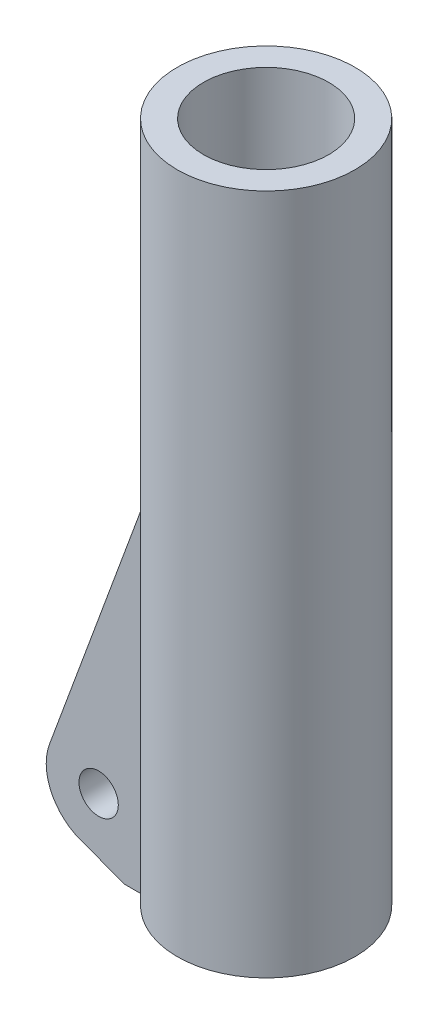
ISO-10303-21;
HEADER;
FILE_DESCRIPTION(('STEP AP214'),'2;1');
FILE_NAME('part.step','',(''),(''),'','','');
FILE_SCHEMA(('AUTOMOTIVE_DESIGN { 1 0 10303 214 1 1 1 1 }'));
ENDSEC;
DATA;
#1=APPLICATION_CONTEXT('core data for automotive mechanical design processes');
#2=APPLICATION_PROTOCOL_DEFINITION('international standard','automotive_design',2000,#1);
#3=PRODUCT_CONTEXT('',#1,'mechanical');
#4=PRODUCT('Part','Part','',(#3));
#5=PRODUCT_RELATED_PRODUCT_CATEGORY('part','',(#4));
#6=PRODUCT_DEFINITION_FORMATION('','',#4);
#7=PRODUCT_DEFINITION_CONTEXT('part definition',#1,'design');
#8=PRODUCT_DEFINITION('design','',#6,#7);
#9=PRODUCT_DEFINITION_SHAPE('','',#8);
#10=(LENGTH_UNIT() NAMED_UNIT(*) SI_UNIT(.MILLI.,.METRE.));
#11=(NAMED_UNIT(*) PLANE_ANGLE_UNIT() SI_UNIT($,.RADIAN.));
#12=(NAMED_UNIT(*) SI_UNIT($,.STERADIAN.) SOLID_ANGLE_UNIT());
#13=UNCERTAINTY_MEASURE_WITH_UNIT(LENGTH_MEASURE(1.E-05),#10,'distance_accuracy_value','');
#14=(GEOMETRIC_REPRESENTATION_CONTEXT(3) GLOBAL_UNCERTAINTY_ASSIGNED_CONTEXT((#13)) GLOBAL_UNIT_ASSIGNED_CONTEXT((#10,
#11,#12)) REPRESENTATION_CONTEXT('',''));
#15=CARTESIAN_POINT('',(0.,0.,0.));
#16=DIRECTION('',(0.,0.,1.));
#17=DIRECTION('',(1.,0.,0.));
#18=AXIS2_PLACEMENT_3D('',#15,#16,#17);
#19=CARTESIAN_POINT('',(0.,165.1,0.));
#20=DIRECTION('',(0.,1.,0.));
#21=DIRECTION('',(0.,0.,1.));
#22=AXIS2_PLACEMENT_3D('',#19,#20,#21);
#23=PLANE('',#22);
#24=CARTESIAN_POINT('',(0.,165.1,0.));
#25=DIRECTION('',(0.,1.,0.));
#26=DIRECTION('',(0.,0.,1.));
#27=AXIS2_PLACEMENT_3D('',#24,#25,#26);
#28=CIRCLE('',#27,43.053);
#29=CARTESIAN_POINT('',(0.,165.1,43.053));
#30=VERTEX_POINT('',#29);
#31=EDGE_CURVE('E126',#30,#30,#28,.T.);
#32=ORIENTED_EDGE('',*,*,#31,.T.);
#33=EDGE_LOOP('',(#32));
#34=FACE_BOUND('',#33,.T.);
#35=CARTESIAN_POINT('',(0.,165.1,0.));
#36=DIRECTION('',(0.,1.,0.));
#37=DIRECTION('',(0.,0.,1.));
#38=AXIS2_PLACEMENT_3D('',#35,#36,#37);
#39=CIRCLE('',#38,30.353);
#40=CARTESIAN_POINT('',(0.,165.1,30.353));
#41=VERTEX_POINT('',#40);
#42=EDGE_CURVE('E120',#41,#41,#39,.T.);
#43=ORIENTED_EDGE('',*,*,#42,.F.);
#44=EDGE_LOOP('',(#43));
#45=FACE_BOUND('',#44,.T.);
#46=ADVANCED_FACE('F35',(#34,#45),#23,.T.);
#47=CARTESIAN_POINT('',(0.,-165.1,0.));
#48=DIRECTION('',(0.,1.,0.));
#49=DIRECTION('',(0.,0.,1.));
#50=AXIS2_PLACEMENT_3D('',#47,#48,#49);
#51=PLANE('',#50);
#52=CARTESIAN_POINT('',(0.,-165.1,0.));
#53=DIRECTION('',(0.,1.,0.));
#54=DIRECTION('',(0.,0.,1.));
#55=AXIS2_PLACEMENT_3D('',#52,#53,#54);
#56=CIRCLE('',#55,30.353);
#57=CARTESIAN_POINT('',(0.,-165.1,30.353));
#58=VERTEX_POINT('',#57);
#59=EDGE_CURVE('E119',#58,#58,#56,.T.);
#60=ORIENTED_EDGE('',*,*,#59,.T.);
#61=EDGE_LOOP('',(#60));
#62=FACE_BOUND('',#61,.T.);
#63=CARTESIAN_POINT('',(0.,-165.1,0.));
#64=DIRECTION('',(0.,1.,0.));
#65=DIRECTION('',(0.,0.,1.));
#66=AXIS2_PLACEMENT_3D('',#63,#64,#65);
#67=CIRCLE('',#66,43.053);
#68=CARTESIAN_POINT('',(-34.7620599073185,-165.1,25.4));
#69=VERTEX_POINT('',#68);
#70=CARTESIAN_POINT('',(-34.7620599073185,-165.1,-25.4));
#71=VERTEX_POINT('',#70);
#72=EDGE_CURVE('E123',#69,#71,#67,.T.);
#73=ORIENTED_EDGE('',*,*,#72,.F.);
#74=DIRECTION('',(1.,0.,0.));
#75=VECTOR('',#74,1.);
#76=CARTESIAN_POINT('',(-43.053,-165.1,25.4));
#77=LINE('',#76,#75);
#78=CARTESIAN_POINT('',(-43.053,-165.1,25.4));
#79=VERTEX_POINT('',#78);
#80=EDGE_CURVE('E86',#79,#69,#77,.T.);
#81=ORIENTED_EDGE('',*,*,#80,.F.);
#82=DIRECTION('',(0.,0.,-1.));
#83=VECTOR('',#82,1.);
#84=CARTESIAN_POINT('',(-43.053,-165.1,25.4));
#85=LINE('',#84,#83);
#86=CARTESIAN_POINT('',(-43.053,-165.1,-25.4));
#87=VERTEX_POINT('',#86);
#88=EDGE_CURVE('E102',#79,#87,#85,.T.);
#89=ORIENTED_EDGE('',*,*,#88,.T.);
#90=DIRECTION('',(1.,0.,0.));
#91=VECTOR('',#90,1.);
#92=CARTESIAN_POINT('',(-43.053,-165.1,-25.4));
#93=LINE('',#92,#91);
#94=EDGE_CURVE('E106',#87,#71,#93,.T.);
#95=ORIENTED_EDGE('',*,*,#94,.T.);
#96=EDGE_LOOP('',(#73,#81,#89,#95));
#97=FACE_BOUND('',#96,.T.);
#98=ADVANCED_FACE('F135',(#62,#97),#51,.F.);
#99=CARTESIAN_POINT('',(0.,165.1,0.));
#100=DIRECTION('',(0.,-1.,0.));
#101=DIRECTION('',(0.,0.,-1.));
#102=AXIS2_PLACEMENT_3D('',#99,#100,#101);
#103=CYLINDRICAL_SURFACE('',#102,43.053);
#104=CARTESIAN_POINT('',(0.,91.3962458919668,0.));
#105=DIRECTION('',(0.938313881066482,-0.345784702666205,0.));
#106=DIRECTION('',(-0.345784702666205,-0.938313881066482,0.));
#107=AXIS2_PLACEMENT_3D('',#104,#105,#106);
#108=ELLIPSE('',#107,124.508110590306,43.053);
#109=CARTESIAN_POINT('',(-34.7620599073185,-2.93332708798165,25.4));
#110=VERTEX_POINT('',#109);
#111=CARTESIAN_POINT('',(-34.7620599073185,-2.93332708798165,-25.4));
#112=VERTEX_POINT('',#111);
#113=EDGE_CURVE('E49',#110,#112,#108,.T.);
#114=ORIENTED_EDGE('',*,*,#113,.F.);
#115=DIRECTION('',(0.,-1.,0.));
#116=VECTOR('',#115,1.);
#117=CARTESIAN_POINT('',(-34.7620599073185,165.1,25.4));
#118=LINE('',#117,#116);
#119=EDGE_CURVE('E11',#110,#69,#118,.T.);
#120=ORIENTED_EDGE('',*,*,#119,.T.);
#121=ORIENTED_EDGE('',*,*,#72,.T.);
#122=DIRECTION('',(0.,-1.,0.));
#123=VECTOR('',#122,1.);
#124=CARTESIAN_POINT('',(-34.7620599073185,165.1,-25.4));
#125=LINE('',#124,#123);
#126=EDGE_CURVE('E43',#112,#71,#125,.T.);
#127=ORIENTED_EDGE('',*,*,#126,.F.);
#128=EDGE_LOOP('',(#114,#120,#121,#127));
#129=FACE_BOUND('',#128,.T.);
#130=ORIENTED_EDGE('',*,*,#31,.F.);
#131=EDGE_LOOP('',(#130));
#132=FACE_BOUND('',#131,.T.);
#133=ADVANCED_FACE('F37',(#129,#132),#103,.T.);
#134=CARTESIAN_POINT('',(0.,165.1,0.));
#135=DIRECTION('',(0.,-1.,0.));
#136=DIRECTION('',(0.,0.,-1.));
#137=AXIS2_PLACEMENT_3D('',#134,#135,#136);
#138=CYLINDRICAL_SURFACE('',#137,30.353);
#139=ORIENTED_EDGE('',*,*,#59,.F.);
#140=EDGE_LOOP('',(#139));
#141=FACE_BOUND('',#140,.T.);
#142=ORIENTED_EDGE('',*,*,#42,.T.);
#143=EDGE_LOOP('',(#142));
#144=FACE_BOUND('',#143,.T.);
#145=ADVANCED_FACE('F150',(#141,#144),#138,.F.);
#146=CARTESIAN_POINT('',(-55.753,-133.35,25.4));
#147=DIRECTION('',(0.,0.,1.));
#148=DIRECTION('',(1.,0.,0.));
#149=AXIS2_PLACEMENT_3D('',#146,#147,#148);
#150=PLANE('',#149);
#151=CARTESIAN_POINT('',(-55.753,-133.35,25.4));
#152=DIRECTION('',(0.,0.,1.));
#153=DIRECTION('',(1.,0.,0.));
#154=AXIS2_PLACEMENT_3D('',#151,#152,#153);
#155=CIRCLE('',#154,9.525);
#156=CARTESIAN_POINT('',(-46.228,-133.35,25.4));
#157=VERTEX_POINT('',#156);
#158=EDGE_CURVE('E109',#157,#157,#155,.T.);
#159=ORIENTED_EDGE('',*,*,#158,.F.);
#160=EDGE_LOOP('',(#159));
#161=FACE_BOUND('',#160,.T.);
#162=ORIENTED_EDGE('',*,*,#119,.F.);
#163=DIRECTION('',(-0.345784702666205,-0.938313881066482,0.));
#164=VECTOR('',#163,1.);
#165=CARTESIAN_POINT('',(-79.5861725790887,-124.567068552278,25.4));
#166=LINE('',#165,#164);
#167=CARTESIAN_POINT('',(-79.5861725790887,-124.567068552278,25.4));
#168=VERTEX_POINT('',#167);
#169=EDGE_CURVE('E77',#110,#168,#166,.T.);
#170=ORIENTED_EDGE('',*,*,#169,.T.);
#171=CARTESIAN_POINT('',(-55.753,-133.35,25.4));
#172=DIRECTION('',(0.,0.,1.));
#173=DIRECTION('',(1.,0.,0.));
#174=AXIS2_PLACEMENT_3D('',#171,#172,#173);
#175=CIRCLE('',#174,25.4);
#176=CARTESIAN_POINT('',(-64.5359314477216,-157.183172579089,25.4));
#177=VERTEX_POINT('',#176);
#178=EDGE_CURVE('E82',#168,#177,#175,.T.);
#179=ORIENTED_EDGE('',*,*,#178,.T.);
#180=DIRECTION('',(0.938313881066482,-0.345784702666205,0.));
#181=VECTOR('',#180,1.);
#182=CARTESIAN_POINT('',(-64.5359314477216,-157.183172579089,25.4));
#183=LINE('',#182,#181);
#184=EDGE_CURVE('E100',#177,#79,#183,.T.);
#185=ORIENTED_EDGE('',*,*,#184,.T.);
#186=ORIENTED_EDGE('',*,*,#80,.T.);
#187=EDGE_LOOP('',(#162,#170,#179,#185,#186));
#188=FACE_BOUND('',#187,.T.);
#189=ADVANCED_FACE('F79',(#161,#188),#150,.T.);
#190=CARTESIAN_POINT('',(-55.753,-133.35,-25.4));
#191=DIRECTION('',(0.,0.,1.));
#192=DIRECTION('',(1.,0.,0.));
#193=AXIS2_PLACEMENT_3D('',#190,#191,#192);
#194=PLANE('',#193);
#195=CARTESIAN_POINT('',(-55.753,-133.35,-25.4));
#196=DIRECTION('',(0.,0.,1.));
#197=DIRECTION('',(1.,0.,0.));
#198=AXIS2_PLACEMENT_3D('',#195,#196,#197);
#199=CIRCLE('',#198,9.525);
#200=CARTESIAN_POINT('',(-46.228,-133.35,-25.4));
#201=VERTEX_POINT('',#200);
#202=EDGE_CURVE('E140',#201,#201,#199,.T.);
#203=ORIENTED_EDGE('',*,*,#202,.T.);
#204=EDGE_LOOP('',(#203));
#205=FACE_BOUND('',#204,.T.);
#206=DIRECTION('',(-0.345784702666205,-0.938313881066482,0.));
#207=VECTOR('',#206,1.);
#208=CARTESIAN_POINT('',(-79.5861725790887,-124.567068552278,-25.4));
#209=LINE('',#208,#207);
#210=CARTESIAN_POINT('',(-79.5861725790887,-124.567068552278,-25.4));
#211=VERTEX_POINT('',#210);
#212=EDGE_CURVE('E92',#112,#211,#209,.T.);
#213=ORIENTED_EDGE('',*,*,#212,.F.);
#214=ORIENTED_EDGE('',*,*,#126,.T.);
#215=ORIENTED_EDGE('',*,*,#94,.F.);
#216=DIRECTION('',(0.938313881066482,-0.345784702666205,0.));
#217=VECTOR('',#216,1.);
#218=CARTESIAN_POINT('',(-64.5359314477216,-157.183172579089,-25.4));
#219=LINE('',#218,#217);
#220=CARTESIAN_POINT('',(-64.5359314477216,-157.183172579089,-25.4));
#221=VERTEX_POINT('',#220);
#222=EDGE_CURVE('E113',#221,#87,#219,.T.);
#223=ORIENTED_EDGE('',*,*,#222,.F.);
#224=CARTESIAN_POINT('',(-55.753,-133.35,-25.4));
#225=DIRECTION('',(0.,0.,1.));
#226=DIRECTION('',(1.,0.,0.));
#227=AXIS2_PLACEMENT_3D('',#224,#225,#226);
#228=CIRCLE('',#227,25.4);
#229=EDGE_CURVE('E111',#211,#221,#228,.T.);
#230=ORIENTED_EDGE('',*,*,#229,.F.);
#231=EDGE_LOOP('',(#213,#214,#215,#223,#230));
#232=FACE_BOUND('',#231,.T.);
#233=ADVANCED_FACE('F132',(#205,#232),#194,.F.);
#234=CARTESIAN_POINT('',(-79.5861725790887,-124.567068552278,25.4));
#235=DIRECTION('',(0.938313881066482,-0.345784702666205,0.));
#236=DIRECTION('',(0.345784702666205,0.938313881066482,0.));
#237=AXIS2_PLACEMENT_3D('',#234,#235,#236);
#238=PLANE('',#237);
#239=ORIENTED_EDGE('',*,*,#169,.F.);
#240=ORIENTED_EDGE('',*,*,#113,.T.);
#241=ORIENTED_EDGE('',*,*,#212,.T.);
#242=DIRECTION('',(0.,0.,-1.));
#243=VECTOR('',#242,1.);
#244=CARTESIAN_POINT('',(-79.5861725790887,-124.567068552278,25.4));
#245=LINE('',#244,#243);
#246=EDGE_CURVE('E89',#168,#211,#245,.T.);
#247=ORIENTED_EDGE('',*,*,#246,.F.);
#248=EDGE_LOOP('',(#239,#240,#241,#247));
#249=FACE_BOUND('',#248,.T.);
#250=ADVANCED_FACE('F90',(#249),#238,.F.);
#251=CARTESIAN_POINT('',(-55.753,-133.35,25.4));
#252=DIRECTION('',(0.,0.,-1.));
#253=DIRECTION('',(-1.,0.,0.));
#254=AXIS2_PLACEMENT_3D('',#251,#252,#253);
#255=CYLINDRICAL_SURFACE('',#254,25.4);
#256=ORIENTED_EDGE('',*,*,#229,.T.);
#257=DIRECTION('',(0.,0.,-1.));
#258=VECTOR('',#257,1.);
#259=CARTESIAN_POINT('',(-64.5359314477216,-157.183172579089,25.4));
#260=LINE('',#259,#258);
#261=EDGE_CURVE('E95',#177,#221,#260,.T.);
#262=ORIENTED_EDGE('',*,*,#261,.F.);
#263=ORIENTED_EDGE('',*,*,#178,.F.);
#264=ORIENTED_EDGE('',*,*,#246,.T.);
#265=EDGE_LOOP('',(#256,#262,#263,#264));
#266=FACE_BOUND('',#265,.T.);
#267=ADVANCED_FACE('F97',(#266),#255,.T.);
#268=CARTESIAN_POINT('',(-64.5359314477216,-157.183172579089,25.4));
#269=DIRECTION('',(0.345784702666205,0.938313881066482,0.));
#270=DIRECTION('',(-0.938313881066482,0.345784702666205,0.));
#271=AXIS2_PLACEMENT_3D('',#268,#269,#270);
#272=PLANE('',#271);
#273=ORIENTED_EDGE('',*,*,#222,.T.);
#274=ORIENTED_EDGE('',*,*,#88,.F.);
#275=ORIENTED_EDGE('',*,*,#184,.F.);
#276=ORIENTED_EDGE('',*,*,#261,.T.);
#277=EDGE_LOOP('',(#273,#274,#275,#276));
#278=FACE_BOUND('',#277,.T.);
#279=ADVANCED_FACE('F138',(#278),#272,.F.);
#280=CARTESIAN_POINT('',(-55.753,-133.35,25.4));
#281=DIRECTION('',(0.,0.,-1.));
#282=DIRECTION('',(-1.,0.,0.));
#283=AXIS2_PLACEMENT_3D('',#280,#281,#282);
#284=CYLINDRICAL_SURFACE('',#283,9.525);
#285=ORIENTED_EDGE('',*,*,#158,.T.);
#286=EDGE_LOOP('',(#285));
#287=FACE_BOUND('',#286,.T.);
#288=ORIENTED_EDGE('',*,*,#202,.F.);
#289=EDGE_LOOP('',(#288));
#290=FACE_BOUND('',#289,.T.);
#291=ADVANCED_FACE('F146',(#287,#290),#284,.F.);
#292=CLOSED_SHELL('',(#46,#98,#133,#145,#189,#233,#250,#267,#279,#291));
#293=MANIFOLD_SOLID_BREP('B2',#292);
#294=ADVANCED_BREP_SHAPE_REPRESENTATION('',(#18,#293),#14);
#295=SHAPE_DEFINITION_REPRESENTATION(#9,#294);
ENDSEC;
END-ISO-10303-21;
